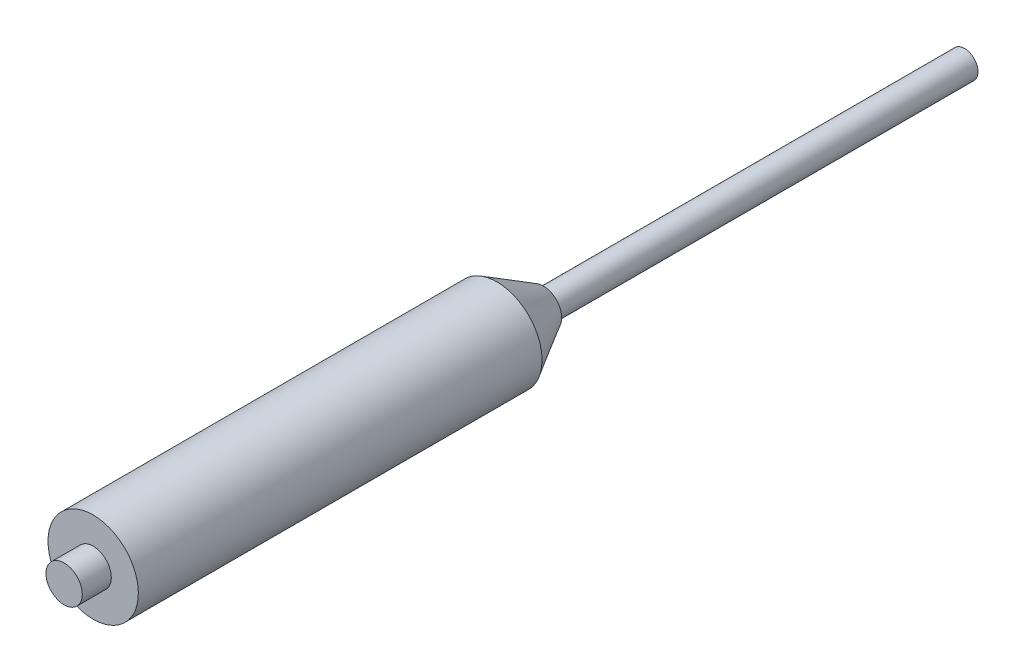
ISO-10303-21;
HEADER;
FILE_DESCRIPTION(('STEP AP214'),'2;1');
FILE_NAME('part.step','',(''),(''),'','','');
FILE_SCHEMA(('AUTOMOTIVE_DESIGN { 1 0 10303 214 1 1 1 1 }'));
ENDSEC;
DATA;
#1=APPLICATION_CONTEXT('core data for automotive mechanical design processes');
#2=APPLICATION_PROTOCOL_DEFINITION('international standard','automotive_design',2000,#1);
#3=PRODUCT_CONTEXT('',#1,'mechanical');
#4=PRODUCT('Part','Part','',(#3));
#5=PRODUCT_RELATED_PRODUCT_CATEGORY('part','',(#4));
#6=PRODUCT_DEFINITION_FORMATION('','',#4);
#7=PRODUCT_DEFINITION_CONTEXT('part definition',#1,'design');
#8=PRODUCT_DEFINITION('design','',#6,#7);
#9=PRODUCT_DEFINITION_SHAPE('','',#8);
#10=(LENGTH_UNIT() NAMED_UNIT(*) SI_UNIT(.MILLI.,.METRE.));
#11=(NAMED_UNIT(*) PLANE_ANGLE_UNIT() SI_UNIT($,.RADIAN.));
#12=(NAMED_UNIT(*) SI_UNIT($,.STERADIAN.) SOLID_ANGLE_UNIT());
#13=UNCERTAINTY_MEASURE_WITH_UNIT(LENGTH_MEASURE(1.E-05),#10,'distance_accuracy_value','');
#14=(GEOMETRIC_REPRESENTATION_CONTEXT(3) GLOBAL_UNCERTAINTY_ASSIGNED_CONTEXT((#13)) GLOBAL_UNIT_ASSIGNED_CONTEXT((#10,
#11,#12)) REPRESENTATION_CONTEXT('',''));
#15=CARTESIAN_POINT('',(0.,0.,0.));
#16=DIRECTION('',(0.,0.,1.));
#17=DIRECTION('',(1.,0.,0.));
#18=AXIS2_PLACEMENT_3D('',#15,#16,#17);
#19=CARTESIAN_POINT('',(0.,0.,78.74));
#20=DIRECTION('',(0.,0.,-1.));
#21=DIRECTION('',(-1.,0.,0.));
#22=AXIS2_PLACEMENT_3D('',#19,#20,#21);
#23=CYLINDRICAL_SURFACE('',#22,3.9497);
#24=CARTESIAN_POINT('',(0.,0.,40.894));
#25=DIRECTION('',(0.,0.,-1.));
#26=DIRECTION('',(-1.,0.,0.));
#27=AXIS2_PLACEMENT_3D('',#24,#25,#26);
#28=CIRCLE('',#27,3.9497);
#29=CARTESIAN_POINT('',(-3.9497,0.,40.894));
#30=VERTEX_POINT('',#29);
#31=EDGE_CURVE('E10',#30,#30,#28,.F.);
#32=ORIENTED_EDGE('',*,*,#31,.T.);
#33=EDGE_LOOP('',(#32));
#34=FACE_BOUND('',#33,.T.);
#35=CARTESIAN_POINT('',(0.,0.,76.2));
#36=DIRECTION('',(0.,0.,1.));
#37=DIRECTION('',(1.,0.,0.));
#38=AXIS2_PLACEMENT_3D('',#35,#36,#37);
#39=CIRCLE('',#38,3.9497);
#40=CARTESIAN_POINT('',(3.9497,0.,76.2));
#41=VERTEX_POINT('',#40);
#42=EDGE_CURVE('E48',#41,#41,#39,.T.);
#43=ORIENTED_EDGE('',*,*,#42,.F.);
#44=EDGE_LOOP('',(#43));
#45=FACE_BOUND('',#44,.T.);
#46=ADVANCED_FACE('F34',(#34,#45),#23,.T.);
#47=CARTESIAN_POINT('',(0.,0.,76.2));
#48=DIRECTION('',(0.,0.,1.));
#49=DIRECTION('',(1.,0.,0.));
#50=AXIS2_PLACEMENT_3D('',#47,#48,#49);
#51=PLANE('',#50);
#52=CARTESIAN_POINT('',(0.,0.,76.2));
#53=DIRECTION('',(0.,0.,1.));
#54=DIRECTION('',(1.,0.,0.));
#55=AXIS2_PLACEMENT_3D('',#52,#53,#54);
#56=CIRCLE('',#55,1.5875);
#57=CARTESIAN_POINT('',(1.5875,0.,76.2));
#58=VERTEX_POINT('',#57);
#59=EDGE_CURVE('E54',#58,#58,#56,.T.);
#60=ORIENTED_EDGE('',*,*,#59,.F.);
#61=EDGE_LOOP('',(#60));
#62=FACE_BOUND('',#61,.T.);
#63=ORIENTED_EDGE('',*,*,#42,.T.);
#64=EDGE_LOOP('',(#63));
#65=FACE_BOUND('',#64,.T.);
#66=ADVANCED_FACE('F89',(#62,#65),#51,.T.);
#67=CARTESIAN_POINT('',(0.,0.,76.2));
#68=DIRECTION('',(0.,0.,1.));
#69=DIRECTION('',(1.,0.,0.));
#70=AXIS2_PLACEMENT_3D('',#67,#68,#69);
#71=CYLINDRICAL_SURFACE('',#70,1.5875);
#72=ORIENTED_EDGE('',*,*,#59,.T.);
#73=EDGE_LOOP('',(#72));
#74=FACE_BOUND('',#73,.T.);
#75=CARTESIAN_POINT('',(0.,0.,78.74));
#76=DIRECTION('',(0.,0.,1.));
#77=DIRECTION('',(1.,0.,0.));
#78=AXIS2_PLACEMENT_3D('',#75,#76,#77);
#79=CIRCLE('',#78,1.5875);
#80=CARTESIAN_POINT('',(1.5875,0.,78.74));
#81=VERTEX_POINT('',#80);
#82=EDGE_CURVE('E57',#81,#81,#79,.T.);
#83=ORIENTED_EDGE('',*,*,#82,.F.);
#84=EDGE_LOOP('',(#83));
#85=FACE_BOUND('',#84,.T.);
#86=ADVANCED_FACE('F84',(#74,#85),#71,.T.);
#87=CARTESIAN_POINT('',(0.,0.,78.74));
#88=DIRECTION('',(0.,0.,1.));
#89=DIRECTION('',(1.,0.,0.));
#90=AXIS2_PLACEMENT_3D('',#87,#88,#89);
#91=PLANE('',#90);
#92=ORIENTED_EDGE('',*,*,#82,.T.);
#93=EDGE_LOOP('',(#92));
#94=FACE_BOUND('',#93,.T.);
#95=ADVANCED_FACE('F76',(#94),#91,.T.);
#96=CARTESIAN_POINT('',(0.,0.,36.83));
#97=DIRECTION('',(0.,0.,-1.));
#98=DIRECTION('',(-1.,0.,0.));
#99=AXIS2_PLACEMENT_3D('',#96,#97,#98);
#100=PLANE('',#99);
#101=CARTESIAN_POINT('',(0.,0.,36.83));
#102=DIRECTION('',(0.,0.,-1.));
#103=DIRECTION('',(-1.,0.,0.));
#104=AXIS2_PLACEMENT_3D('',#101,#102,#103);
#105=CIRCLE('',#104,1.60334850601338);
#106=CARTESIAN_POINT('',(-1.60334850601338,0.,36.83));
#107=VERTEX_POINT('',#106);
#108=EDGE_CURVE('E42',#107,#107,#105,.T.);
#109=ORIENTED_EDGE('',*,*,#108,.T.);
#110=EDGE_LOOP('',(#109));
#111=FACE_BOUND('',#110,.T.);
#112=CARTESIAN_POINT('',(0.,0.,36.83));
#113=DIRECTION('',(0.,0.,-1.));
#114=DIRECTION('',(-1.,0.,0.));
#115=AXIS2_PLACEMENT_3D('',#112,#113,#114);
#116=CIRCLE('',#115,1.1811);
#117=CARTESIAN_POINT('',(-1.1811,0.,36.83));
#118=VERTEX_POINT('',#117);
#119=EDGE_CURVE('E61',#118,#118,#116,.T.);
#120=ORIENTED_EDGE('',*,*,#119,.F.);
#121=EDGE_LOOP('',(#120));
#122=FACE_BOUND('',#121,.T.);
#123=ADVANCED_FACE('F74',(#111,#122),#100,.T.);
#124=CARTESIAN_POINT('',(0.,0.,36.83));
#125=DIRECTION('',(0.,0.,-1.));
#126=DIRECTION('',(-1.,0.,0.));
#127=AXIS2_PLACEMENT_3D('',#124,#125,#126);
#128=CYLINDRICAL_SURFACE('',#127,1.1811);
#129=ORIENTED_EDGE('',*,*,#119,.T.);
#130=EDGE_LOOP('',(#129));
#131=FACE_BOUND('',#130,.T.);
#132=CARTESIAN_POINT('',(0.,0.,0.));
#133=DIRECTION('',(0.,0.,-1.));
#134=DIRECTION('',(-1.,0.,0.));
#135=AXIS2_PLACEMENT_3D('',#132,#133,#134);
#136=CIRCLE('',#135,1.1811);
#137=CARTESIAN_POINT('',(-1.1811,0.,0.));
#138=VERTEX_POINT('',#137);
#139=EDGE_CURVE('E65',#138,#138,#136,.T.);
#140=ORIENTED_EDGE('',*,*,#139,.F.);
#141=EDGE_LOOP('',(#140));
#142=FACE_BOUND('',#141,.T.);
#143=ADVANCED_FACE('F71',(#131,#142),#128,.T.);
#144=CARTESIAN_POINT('',(0.,0.,0.));
#145=DIRECTION('',(0.,0.,1.));
#146=DIRECTION('',(1.,0.,0.));
#147=AXIS2_PLACEMENT_3D('',#144,#145,#146);
#148=PLANE('',#147);
#149=ORIENTED_EDGE('',*,*,#139,.T.);
#150=EDGE_LOOP('',(#149));
#151=FACE_BOUND('',#150,.T.);
#152=ADVANCED_FACE('F82',(#151),#148,.F.);
#153=CARTESIAN_POINT('',(0.,0.,36.83));
#154=DIRECTION('',(0.,0.,1.));
#155=DIRECTION('',(1.,0.,0.));
#156=AXIS2_PLACEMENT_3D('',#153,#154,#155);
#157=CONICAL_SURFACE('',#156,1.60334850601338,0.523598775598296);
#158=ORIENTED_EDGE('',*,*,#31,.F.);
#159=EDGE_LOOP('',(#158));
#160=FACE_BOUND('',#159,.T.);
#161=ORIENTED_EDGE('',*,*,#108,.F.);
#162=EDGE_LOOP('',(#161));
#163=FACE_BOUND('',#162,.T.);
#164=ADVANCED_FACE('F36',(#160,#163),#157,.T.);
#165=CLOSED_SHELL('',(#46,#66,#86,#95,#123,#143,#152,#164));
#166=MANIFOLD_SOLID_BREP('B2',#165);
#167=ADVANCED_BREP_SHAPE_REPRESENTATION('',(#18,#166),#14);
#168=SHAPE_DEFINITION_REPRESENTATION(#9,#167);
ENDSEC;
END-ISO-10303-21;
